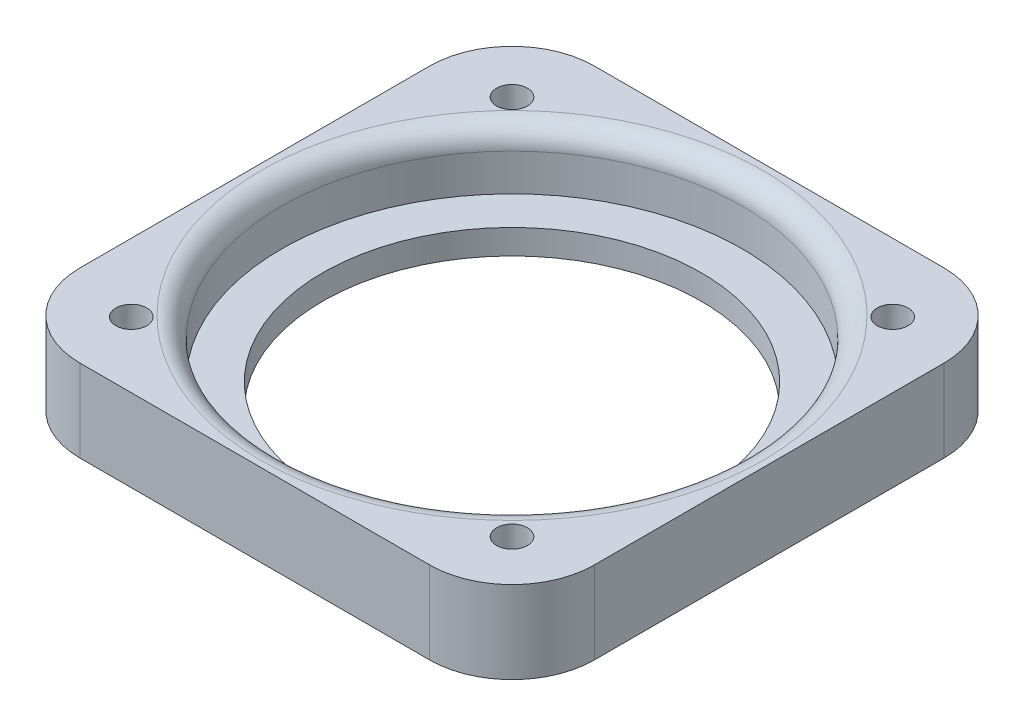
ISO-10303-21;
HEADER;
FILE_DESCRIPTION(('STEP AP214'),'2;1');
FILE_NAME('part.step','',(''),(''),'','','');
FILE_SCHEMA(('AUTOMOTIVE_DESIGN { 1 0 10303 214 1 1 1 1 }'));
ENDSEC;
DATA;
#1=APPLICATION_CONTEXT('core data for automotive mechanical design processes');
#2=APPLICATION_PROTOCOL_DEFINITION('international standard','automotive_design',2000,#1);
#3=PRODUCT_CONTEXT('',#1,'mechanical');
#4=PRODUCT('Part','Part','',(#3));
#5=PRODUCT_RELATED_PRODUCT_CATEGORY('part','',(#4));
#6=PRODUCT_DEFINITION_FORMATION('','',#4);
#7=PRODUCT_DEFINITION_CONTEXT('part definition',#1,'design');
#8=PRODUCT_DEFINITION('design','',#6,#7);
#9=PRODUCT_DEFINITION_SHAPE('','',#8);
#10=(LENGTH_UNIT() NAMED_UNIT(*) SI_UNIT(.MILLI.,.METRE.));
#11=(NAMED_UNIT(*) PLANE_ANGLE_UNIT() SI_UNIT($,.RADIAN.));
#12=(NAMED_UNIT(*) SI_UNIT($,.STERADIAN.) SOLID_ANGLE_UNIT());
#13=UNCERTAINTY_MEASURE_WITH_UNIT(LENGTH_MEASURE(1.E-05),#10,'distance_accuracy_value','');
#14=(GEOMETRIC_REPRESENTATION_CONTEXT(3) GLOBAL_UNCERTAINTY_ASSIGNED_CONTEXT((#13)) GLOBAL_UNIT_ASSIGNED_CONTEXT((#10,
#11,#12)) REPRESENTATION_CONTEXT('',''));
#15=CARTESIAN_POINT('',(0.,0.,0.));
#16=DIRECTION('',(0.,0.,1.));
#17=DIRECTION('',(1.,0.,0.));
#18=AXIS2_PLACEMENT_3D('',#15,#16,#17);
#19=CARTESIAN_POINT('',(-18.3847763108502,8.,-18.3847763108502));
#20=DIRECTION('',(0.,-1.,0.));
#21=DIRECTION('',(0.,0.,-1.));
#22=AXIS2_PLACEMENT_3D('',#19,#20,#21);
#23=CYLINDRICAL_SURFACE('',#22,1.5);
#24=CARTESIAN_POINT('',(-18.3847763108502,8.,-18.3847763108502));
#25=DIRECTION('',(0.,1.,0.));
#26=DIRECTION('',(0.,0.,1.));
#27=AXIS2_PLACEMENT_3D('',#24,#25,#26);
#28=CIRCLE('',#27,1.5);
#29=CARTESIAN_POINT('',(-18.3847763108502,8.,-16.8847763108502));
#30=VERTEX_POINT('',#29);
#31=EDGE_CURVE('E242',#30,#30,#28,.T.);
#32=ORIENTED_EDGE('',*,*,#31,.T.);
#33=EDGE_LOOP('',(#32));
#34=FACE_BOUND('',#33,.T.);
#35=CARTESIAN_POINT('',(-18.3847763108502,2.,-18.3847763108502));
#36=DIRECTION('',(0.,-1.,0.));
#37=DIRECTION('',(0.,0.,-1.));
#38=AXIS2_PLACEMENT_3D('',#35,#36,#37);
#39=CIRCLE('',#38,1.5);
#40=CARTESIAN_POINT('',(-18.3847763108502,2.,-19.8847763108502));
#41=VERTEX_POINT('',#40);
#42=EDGE_CURVE('E133',#41,#41,#39,.T.);
#43=ORIENTED_EDGE('',*,*,#42,.T.);
#44=EDGE_LOOP('',(#43));
#45=FACE_BOUND('',#44,.T.);
#46=ADVANCED_FACE('F129',(#34,#45),#23,.F.);
#47=CARTESIAN_POINT('',(18.6152236891498,8.,-18.3847763108513));
#48=DIRECTION('',(0.,-1.,0.));
#49=DIRECTION('',(0.,0.,-1.));
#50=AXIS2_PLACEMENT_3D('',#47,#48,#49);
#51=CYLINDRICAL_SURFACE('',#50,1.5);
#52=CARTESIAN_POINT('',(18.6152236891498,8.,-18.3847763108513));
#53=DIRECTION('',(0.,1.,0.));
#54=DIRECTION('',(0.,0.,1.));
#55=AXIS2_PLACEMENT_3D('',#52,#53,#54);
#56=CIRCLE('',#55,1.5);
#57=CARTESIAN_POINT('',(18.6152236891498,8.,-16.8847763108513));
#58=VERTEX_POINT('',#57);
#59=EDGE_CURVE('E226',#58,#58,#56,.T.);
#60=ORIENTED_EDGE('',*,*,#59,.T.);
#61=EDGE_LOOP('',(#60));
#62=FACE_BOUND('',#61,.T.);
#63=CARTESIAN_POINT('',(18.6152236891498,2.,-18.3847763108513));
#64=DIRECTION('',(0.,-1.,0.));
#65=DIRECTION('',(0.,0.,-1.));
#66=AXIS2_PLACEMENT_3D('',#63,#64,#65);
#67=CIRCLE('',#66,1.5);
#68=CARTESIAN_POINT('',(18.6152236891498,2.,-19.8847763108513));
#69=VERTEX_POINT('',#68);
#70=EDGE_CURVE('E297',#69,#69,#67,.T.);
#71=ORIENTED_EDGE('',*,*,#70,.T.);
#72=EDGE_LOOP('',(#71));
#73=FACE_BOUND('',#72,.T.);
#74=ADVANCED_FACE('F352',(#62,#73),#51,.F.);
#75=CARTESIAN_POINT('',(18.6152236891508,8.,18.6152236891487));
#76=DIRECTION('',(0.,-1.,0.));
#77=DIRECTION('',(0.,0.,-1.));
#78=AXIS2_PLACEMENT_3D('',#75,#76,#77);
#79=CYLINDRICAL_SURFACE('',#78,1.5);
#80=CARTESIAN_POINT('',(18.6152236891508,8.,18.6152236891487));
#81=DIRECTION('',(0.,1.,0.));
#82=DIRECTION('',(0.,0.,1.));
#83=AXIS2_PLACEMENT_3D('',#80,#81,#82);
#84=CIRCLE('',#83,1.5);
#85=CARTESIAN_POINT('',(18.6152236891508,8.,20.1152236891487));
#86=VERTEX_POINT('',#85);
#87=EDGE_CURVE('E229',#86,#86,#84,.T.);
#88=ORIENTED_EDGE('',*,*,#87,.T.);
#89=EDGE_LOOP('',(#88));
#90=FACE_BOUND('',#89,.T.);
#91=CARTESIAN_POINT('',(18.6152236891508,2.,18.6152236891487));
#92=DIRECTION('',(0.,-1.,0.));
#93=DIRECTION('',(0.,0.,-1.));
#94=AXIS2_PLACEMENT_3D('',#91,#92,#93);
#95=CIRCLE('',#94,1.5);
#96=CARTESIAN_POINT('',(18.6152236891508,2.,17.1152236891487));
#97=VERTEX_POINT('',#96);
#98=EDGE_CURVE('E293',#97,#97,#95,.T.);
#99=ORIENTED_EDGE('',*,*,#98,.T.);
#100=EDGE_LOOP('',(#99));
#101=FACE_BOUND('',#100,.T.);
#102=ADVANCED_FACE('F357',(#90,#101),#79,.F.);
#103=CARTESIAN_POINT('',(-18.3847763108492,8.,18.6152236891498));
#104=DIRECTION('',(0.,-1.,0.));
#105=DIRECTION('',(0.,0.,-1.));
#106=AXIS2_PLACEMENT_3D('',#103,#104,#105);
#107=CYLINDRICAL_SURFACE('',#106,1.5);
#108=CARTESIAN_POINT('',(-18.3847763108492,8.,18.6152236891498));
#109=DIRECTION('',(0.,1.,0.));
#110=DIRECTION('',(0.,0.,1.));
#111=AXIS2_PLACEMENT_3D('',#108,#109,#110);
#112=CIRCLE('',#111,1.5);
#113=CARTESIAN_POINT('',(-18.3847763108492,8.,20.1152236891498));
#114=VERTEX_POINT('',#113);
#115=EDGE_CURVE('E224',#114,#114,#112,.T.);
#116=ORIENTED_EDGE('',*,*,#115,.T.);
#117=EDGE_LOOP('',(#116));
#118=FACE_BOUND('',#117,.T.);
#119=CARTESIAN_POINT('',(-18.3847763108492,2.,18.6152236891498));
#120=DIRECTION('',(0.,-1.,0.));
#121=DIRECTION('',(0.,0.,-1.));
#122=AXIS2_PLACEMENT_3D('',#119,#120,#121);
#123=CIRCLE('',#122,1.5);
#124=CARTESIAN_POINT('',(-18.3847763108492,2.,17.1152236891498));
#125=VERTEX_POINT('',#124);
#126=EDGE_CURVE('E289',#125,#125,#123,.T.);
#127=ORIENTED_EDGE('',*,*,#126,.T.);
#128=EDGE_LOOP('',(#127));
#129=FACE_BOUND('',#128,.T.);
#130=ADVANCED_FACE('F371',(#118,#129),#107,.F.);
#131=CARTESIAN_POINT('',(0.,8.,0.));
#132=DIRECTION('',(0.,1.,0.));
#133=DIRECTION('',(0.,0.,1.));
#134=AXIS2_PLACEMENT_3D('',#131,#132,#133);
#135=PLANE('',#134);
#136=CARTESIAN_POINT('',(0.,8.,0.));
#137=DIRECTION('',(0.,1.,0.));
#138=DIRECTION('',(0.,0.,1.));
#139=AXIS2_PLACEMENT_3D('',#136,#137,#138);
#140=CIRCLE('',#139,24.4);
#141=CARTESIAN_POINT('',(0.,8.,24.4));
#142=VERTEX_POINT('',#141);
#143=EDGE_CURVE('E12',#142,#142,#140,.F.);
#144=ORIENTED_EDGE('',*,*,#143,.T.);
#145=EDGE_LOOP('',(#144));
#146=FACE_BOUND('',#145,.T.);
#147=ORIENTED_EDGE('',*,*,#59,.F.);
#148=EDGE_LOOP('',(#147));
#149=FACE_BOUND('',#148,.T.);
#150=ORIENTED_EDGE('',*,*,#87,.F.);
#151=EDGE_LOOP('',(#150));
#152=FACE_BOUND('',#151,.T.);
#153=ORIENTED_EDGE('',*,*,#115,.F.);
#154=EDGE_LOOP('',(#153));
#155=FACE_BOUND('',#154,.T.);
#156=ORIENTED_EDGE('',*,*,#31,.F.);
#157=EDGE_LOOP('',(#156));
#158=FACE_BOUND('',#157,.T.);
#159=DIRECTION('',(0.,0.,1.));
#160=VECTOR('',#159,1.);
#161=CARTESIAN_POINT('',(-25.,8.,0.));
#162=LINE('',#161,#160);
#163=CARTESIAN_POINT('',(-25.,8.,-17.));
#164=VERTEX_POINT('',#163);
#165=CARTESIAN_POINT('',(-25.,8.,17.));
#166=VERTEX_POINT('',#165);
#167=EDGE_CURVE('E248',#164,#166,#162,.T.);
#168=ORIENTED_EDGE('',*,*,#167,.T.);
#169=CARTESIAN_POINT('',(-17.,8.,17.));
#170=DIRECTION('',(0.,1.,0.));
#171=DIRECTION('',(0.,0.,1.));
#172=AXIS2_PLACEMENT_3D('',#169,#170,#171);
#173=CIRCLE('',#172,8.);
#174=CARTESIAN_POINT('',(-17.,8.,25.));
#175=VERTEX_POINT('',#174);
#176=EDGE_CURVE('E276',#166,#175,#173,.T.);
#177=ORIENTED_EDGE('',*,*,#176,.T.);
#178=DIRECTION('',(1.,0.,0.));
#179=VECTOR('',#178,1.);
#180=CARTESIAN_POINT('',(0.,8.,25.));
#181=LINE('',#180,#179);
#182=CARTESIAN_POINT('',(17.,8.,25.));
#183=VERTEX_POINT('',#182);
#184=EDGE_CURVE('E218',#175,#183,#181,.T.);
#185=ORIENTED_EDGE('',*,*,#184,.T.);
#186=CARTESIAN_POINT('',(17.,8.,17.));
#187=DIRECTION('',(0.,1.,0.));
#188=DIRECTION('',(0.,0.,1.));
#189=AXIS2_PLACEMENT_3D('',#186,#187,#188);
#190=CIRCLE('',#189,8.);
#191=CARTESIAN_POINT('',(25.,8.,17.));
#192=VERTEX_POINT('',#191);
#193=EDGE_CURVE('E274',#183,#192,#190,.T.);
#194=ORIENTED_EDGE('',*,*,#193,.T.);
#195=DIRECTION('',(0.,0.,1.));
#196=VECTOR('',#195,1.);
#197=CARTESIAN_POINT('',(25.,8.,0.));
#198=LINE('',#197,#196);
#199=CARTESIAN_POINT('',(25.,8.,-17.));
#200=VERTEX_POINT('',#199);
#201=EDGE_CURVE('E237',#200,#192,#198,.T.);
#202=ORIENTED_EDGE('',*,*,#201,.F.);
#203=CARTESIAN_POINT('',(17.,8.,-17.));
#204=DIRECTION('',(0.,1.,0.));
#205=DIRECTION('',(0.,0.,1.));
#206=AXIS2_PLACEMENT_3D('',#203,#204,#205);
#207=CIRCLE('',#206,8.);
#208=CARTESIAN_POINT('',(17.,8.,-25.));
#209=VERTEX_POINT('',#208);
#210=EDGE_CURVE('E146',#200,#209,#207,.T.);
#211=ORIENTED_EDGE('',*,*,#210,.T.);
#212=DIRECTION('',(1.,0.,0.));
#213=VECTOR('',#212,1.);
#214=CARTESIAN_POINT('',(0.,8.,-25.));
#215=LINE('',#214,#213);
#216=CARTESIAN_POINT('',(-17.,8.,-25.));
#217=VERTEX_POINT('',#216);
#218=EDGE_CURVE('E245',#217,#209,#215,.T.);
#219=ORIENTED_EDGE('',*,*,#218,.F.);
#220=CARTESIAN_POINT('',(-17.,8.,-17.));
#221=DIRECTION('',(0.,1.,0.));
#222=DIRECTION('',(0.,0.,1.));
#223=AXIS2_PLACEMENT_3D('',#220,#221,#222);
#224=CIRCLE('',#223,8.);
#225=EDGE_CURVE('E271',#217,#164,#224,.T.);
#226=ORIENTED_EDGE('',*,*,#225,.T.);
#227=EDGE_LOOP('',(#168,#177,#185,#194,#202,#211,#219,#226));
#228=FACE_BOUND('',#227,.T.);
#229=ADVANCED_FACE('F331',(#146,#149,#152,#155,#158,#228),#135,.T.);
#230=CARTESIAN_POINT('',(0.,0.,0.));
#231=DIRECTION('',(0.,1.,0.));
#232=DIRECTION('',(0.,0.,1.));
#233=AXIS2_PLACEMENT_3D('',#230,#231,#232);
#234=PLANE('',#233);
#235=CARTESIAN_POINT('',(18.3847763108492,0.,-18.6152236891498));
#236=DIRECTION('',(0.,-1.,0.));
#237=DIRECTION('',(0.,0.,1.));
#238=AXIS2_PLACEMENT_3D('',#235,#236,#237);
#239=CIRCLE('',#238,3.5);
#240=CARTESIAN_POINT('',(18.3847763108492,0.,-15.1152236891498));
#241=VERTEX_POINT('',#240);
#242=EDGE_CURVE('E305',#241,#241,#239,.T.);
#243=ORIENTED_EDGE('',*,*,#242,.F.);
#244=EDGE_LOOP('',(#243));
#245=FACE_BOUND('',#244,.T.);
#246=CARTESIAN_POINT('',(-18.61522368915,0.,-18.384776310849));
#247=DIRECTION('',(0.,-1.,0.));
#248=DIRECTION('',(1.,0.,0.));
#249=AXIS2_PLACEMENT_3D('',#246,#247,#248);
#250=CIRCLE('',#249,3.5);
#251=CARTESIAN_POINT('',(-15.11522368915,0.,-18.384776310849));
#252=VERTEX_POINT('',#251);
#253=EDGE_CURVE('E315',#252,#252,#250,.T.);
#254=ORIENTED_EDGE('',*,*,#253,.F.);
#255=EDGE_LOOP('',(#254));
#256=FACE_BOUND('',#255,.T.);
#257=CARTESIAN_POINT('',(18.6152236891498,0.,18.3847763108491));
#258=DIRECTION('',(0.,-1.,0.));
#259=DIRECTION('',(-1.,0.,0.));
#260=AXIS2_PLACEMENT_3D('',#257,#258,#259);
#261=CIRCLE('',#260,3.5);
#262=CARTESIAN_POINT('',(15.1152236891498,0.,18.3847763108491));
#263=VERTEX_POINT('',#262);
#264=EDGE_CURVE('E303',#263,#263,#261,.T.);
#265=ORIENTED_EDGE('',*,*,#264,.F.);
#266=EDGE_LOOP('',(#265));
#267=FACE_BOUND('',#266,.T.);
#268=CARTESIAN_POINT('',(-18.3847763108492,0.,18.6152236891498));
#269=DIRECTION('',(0.,-1.,0.));
#270=DIRECTION('',(0.,0.,-1.));
#271=AXIS2_PLACEMENT_3D('',#268,#269,#270);
#272=CIRCLE('',#271,3.5);
#273=CARTESIAN_POINT('',(-18.3847763108492,0.,15.1152236891498));
#274=VERTEX_POINT('',#273);
#275=EDGE_CURVE('E295',#274,#274,#272,.T.);
#276=ORIENTED_EDGE('',*,*,#275,.F.);
#277=EDGE_LOOP('',(#276));
#278=FACE_BOUND('',#277,.T.);
#279=CARTESIAN_POINT('',(0.,0.,0.));
#280=DIRECTION('',(0.,1.,0.));
#281=DIRECTION('',(0.,0.,1.));
#282=AXIS2_PLACEMENT_3D('',#279,#280,#281);
#283=CIRCLE('',#282,18.4);
#284=CARTESIAN_POINT('',(0.,0.,18.4));
#285=VERTEX_POINT('',#284);
#286=EDGE_CURVE('E257',#285,#285,#283,.T.);
#287=ORIENTED_EDGE('',*,*,#286,.T.);
#288=EDGE_LOOP('',(#287));
#289=FACE_BOUND('',#288,.T.);
#290=DIRECTION('',(1.,0.,0.));
#291=VECTOR('',#290,1.);
#292=CARTESIAN_POINT('',(0.,0.,25.));
#293=LINE('',#292,#291);
#294=CARTESIAN_POINT('',(-17.,0.,25.));
#295=VERTEX_POINT('',#294);
#296=CARTESIAN_POINT('',(17.,0.,25.));
#297=VERTEX_POINT('',#296);
#298=EDGE_CURVE('E215',#295,#297,#293,.T.);
#299=ORIENTED_EDGE('',*,*,#298,.F.);
#300=CARTESIAN_POINT('',(-17.,0.,17.));
#301=DIRECTION('',(0.,1.,0.));
#302=DIRECTION('',(0.,0.,1.));
#303=AXIS2_PLACEMENT_3D('',#300,#301,#302);
#304=CIRCLE('',#303,8.);
#305=CARTESIAN_POINT('',(-25.,0.,17.));
#306=VERTEX_POINT('',#305);
#307=EDGE_CURVE('E198',#295,#306,#304,.F.);
#308=ORIENTED_EDGE('',*,*,#307,.T.);
#309=DIRECTION('',(0.,0.,1.));
#310=VECTOR('',#309,1.);
#311=CARTESIAN_POINT('',(-25.,0.,0.));
#312=LINE('',#311,#310);
#313=CARTESIAN_POINT('',(-25.,0.,-17.));
#314=VERTEX_POINT('',#313);
#315=EDGE_CURVE('E246',#314,#306,#312,.T.);
#316=ORIENTED_EDGE('',*,*,#315,.F.);
#317=CARTESIAN_POINT('',(-17.,0.,-17.));
#318=DIRECTION('',(0.,1.,0.));
#319=DIRECTION('',(0.,0.,1.));
#320=AXIS2_PLACEMENT_3D('',#317,#318,#319);
#321=CIRCLE('',#320,8.);
#322=CARTESIAN_POINT('',(-17.,0.,-25.));
#323=VERTEX_POINT('',#322);
#324=EDGE_CURVE('E219',#314,#323,#321,.F.);
#325=ORIENTED_EDGE('',*,*,#324,.T.);
#326=DIRECTION('',(1.,0.,0.));
#327=VECTOR('',#326,1.);
#328=CARTESIAN_POINT('',(0.,0.,-25.));
#329=LINE('',#328,#327);
#330=CARTESIAN_POINT('',(17.,0.,-25.));
#331=VERTEX_POINT('',#330);
#332=EDGE_CURVE('E236',#323,#331,#329,.T.);
#333=ORIENTED_EDGE('',*,*,#332,.T.);
#334=CARTESIAN_POINT('',(17.,0.,-17.));
#335=DIRECTION('',(0.,1.,0.));
#336=DIRECTION('',(0.,0.,1.));
#337=AXIS2_PLACEMENT_3D('',#334,#335,#336);
#338=CIRCLE('',#337,8.);
#339=CARTESIAN_POINT('',(25.,0.,-17.));
#340=VERTEX_POINT('',#339);
#341=EDGE_CURVE('E265',#331,#340,#338,.F.);
#342=ORIENTED_EDGE('',*,*,#341,.T.);
#343=DIRECTION('',(0.,0.,1.));
#344=VECTOR('',#343,1.);
#345=CARTESIAN_POINT('',(25.,0.,0.));
#346=LINE('',#345,#344);
#347=CARTESIAN_POINT('',(25.,0.,17.));
#348=VERTEX_POINT('',#347);
#349=EDGE_CURVE('E234',#340,#348,#346,.T.);
#350=ORIENTED_EDGE('',*,*,#349,.T.);
#351=CARTESIAN_POINT('',(17.,0.,17.));
#352=DIRECTION('',(0.,1.,0.));
#353=DIRECTION('',(0.,0.,1.));
#354=AXIS2_PLACEMENT_3D('',#351,#352,#353);
#355=CIRCLE('',#354,8.);
#356=EDGE_CURVE('E209',#348,#297,#355,.F.);
#357=ORIENTED_EDGE('',*,*,#356,.T.);
#358=EDGE_LOOP('',(#299,#308,#316,#325,#333,#342,#350,#357));
#359=FACE_BOUND('',#358,.T.);
#360=ADVANCED_FACE('F222',(#245,#256,#267,#278,#289,#359),#234,.F.);
#361=CARTESIAN_POINT('',(0.,2.4,0.));
#362=DIRECTION('',(0.,1.,0.));
#363=DIRECTION('',(0.,0.,1.));
#364=AXIS2_PLACEMENT_3D('',#361,#362,#363);
#365=CYLINDRICAL_SURFACE('',#364,22.4);
#366=CARTESIAN_POINT('',(0.,6.,0.));
#367=DIRECTION('',(0.,1.,0.));
#368=DIRECTION('',(0.,0.,1.));
#369=AXIS2_PLACEMENT_3D('',#366,#367,#368);
#370=CIRCLE('',#369,22.4);
#371=CARTESIAN_POINT('',(0.,6.,22.4));
#372=VERTEX_POINT('',#371);
#373=EDGE_CURVE('E138',#372,#372,#370,.T.);
#374=ORIENTED_EDGE('',*,*,#373,.T.);
#375=EDGE_LOOP('',(#374));
#376=FACE_BOUND('',#375,.T.);
#377=CARTESIAN_POINT('',(0.,2.4,0.));
#378=DIRECTION('',(0.,1.,0.));
#379=DIRECTION('',(0.,0.,1.));
#380=AXIS2_PLACEMENT_3D('',#377,#378,#379);
#381=CIRCLE('',#380,22.4);
#382=CARTESIAN_POINT('',(0.,2.4,22.4));
#383=VERTEX_POINT('',#382);
#384=EDGE_CURVE('E260',#383,#383,#381,.T.);
#385=ORIENTED_EDGE('',*,*,#384,.F.);
#386=EDGE_LOOP('',(#385));
#387=FACE_BOUND('',#386,.T.);
#388=ADVANCED_FACE('F330',(#376,#387),#365,.F.);
#389=CARTESIAN_POINT('',(0.,2.4,0.));
#390=DIRECTION('',(0.,1.,0.));
#391=DIRECTION('',(0.,0.,1.));
#392=AXIS2_PLACEMENT_3D('',#389,#390,#391);
#393=PLANE('',#392);
#394=CARTESIAN_POINT('',(0.,2.4,0.));
#395=DIRECTION('',(0.,1.,0.));
#396=DIRECTION('',(0.,0.,1.));
#397=AXIS2_PLACEMENT_3D('',#394,#395,#396);
#398=CIRCLE('',#397,18.4);
#399=CARTESIAN_POINT('',(0.,2.4,18.4));
#400=VERTEX_POINT('',#399);
#401=EDGE_CURVE('E251',#400,#400,#398,.T.);
#402=ORIENTED_EDGE('',*,*,#401,.F.);
#403=EDGE_LOOP('',(#402));
#404=FACE_BOUND('',#403,.T.);
#405=ORIENTED_EDGE('',*,*,#384,.T.);
#406=EDGE_LOOP('',(#405));
#407=FACE_BOUND('',#406,.T.);
#408=ADVANCED_FACE('F339',(#404,#407),#393,.T.);
#409=CARTESIAN_POINT('',(0.,-10.1,0.));
#410=DIRECTION('',(0.,1.,0.));
#411=DIRECTION('',(0.,0.,1.));
#412=AXIS2_PLACEMENT_3D('',#409,#410,#411);
#413=CYLINDRICAL_SURFACE('',#412,18.4);
#414=ORIENTED_EDGE('',*,*,#401,.T.);
#415=EDGE_LOOP('',(#414));
#416=FACE_BOUND('',#415,.T.);
#417=ORIENTED_EDGE('',*,*,#286,.F.);
#418=EDGE_LOOP('',(#417));
#419=FACE_BOUND('',#418,.T.);
#420=ADVANCED_FACE('F336',(#416,#419),#413,.F.);
#421=CARTESIAN_POINT('',(0.,8.,-25.));
#422=DIRECTION('',(0.,0.,-1.));
#423=DIRECTION('',(-1.,0.,0.));
#424=AXIS2_PLACEMENT_3D('',#421,#422,#423);
#425=PLANE('',#424);
#426=ORIENTED_EDGE('',*,*,#218,.T.);
#427=DIRECTION('',(0.,-1.,0.));
#428=VECTOR('',#427,1.);
#429=CARTESIAN_POINT('',(17.,8.,-25.));
#430=LINE('',#429,#428);
#431=EDGE_CURVE('E284',#209,#331,#430,.T.);
#432=ORIENTED_EDGE('',*,*,#431,.T.);
#433=ORIENTED_EDGE('',*,*,#332,.F.);
#434=DIRECTION('',(0.,-1.,0.));
#435=VECTOR('',#434,1.);
#436=CARTESIAN_POINT('',(-17.,8.,-25.));
#437=LINE('',#436,#435);
#438=EDGE_CURVE('E153',#323,#217,#437,.F.);
#439=ORIENTED_EDGE('',*,*,#438,.T.);
#440=EDGE_LOOP('',(#426,#432,#433,#439));
#441=FACE_BOUND('',#440,.T.);
#442=ADVANCED_FACE('F338',(#441),#425,.T.);
#443=CARTESIAN_POINT('',(-25.,8.,0.));
#444=DIRECTION('',(1.,0.,0.));
#445=DIRECTION('',(0.,0.,-1.));
#446=AXIS2_PLACEMENT_3D('',#443,#444,#445);
#447=PLANE('',#446);
#448=ORIENTED_EDGE('',*,*,#315,.T.);
#449=DIRECTION('',(0.,-1.,0.));
#450=VECTOR('',#449,1.);
#451=CARTESIAN_POINT('',(-25.,8.,17.));
#452=LINE('',#451,#450);
#453=EDGE_CURVE('E203',#306,#166,#452,.F.);
#454=ORIENTED_EDGE('',*,*,#453,.T.);
#455=ORIENTED_EDGE('',*,*,#167,.F.);
#456=DIRECTION('',(0.,-1.,0.));
#457=VECTOR('',#456,1.);
#458=CARTESIAN_POINT('',(-25.,0.,-17.));
#459=LINE('',#458,#457);
#460=EDGE_CURVE('E208',#164,#314,#459,.T.);
#461=ORIENTED_EDGE('',*,*,#460,.T.);
#462=EDGE_LOOP('',(#448,#454,#455,#461));
#463=FACE_BOUND('',#462,.T.);
#464=ADVANCED_FACE('F346',(#463),#447,.F.);
#465=CARTESIAN_POINT('',(25.,8.,0.));
#466=DIRECTION('',(1.,0.,0.));
#467=DIRECTION('',(0.,0.,-1.));
#468=AXIS2_PLACEMENT_3D('',#465,#466,#467);
#469=PLANE('',#468);
#470=ORIENTED_EDGE('',*,*,#201,.T.);
#471=DIRECTION('',(0.,-1.,0.));
#472=VECTOR('',#471,1.);
#473=CARTESIAN_POINT('',(25.,0.,17.));
#474=LINE('',#473,#472);
#475=EDGE_CURVE('E280',#192,#348,#474,.T.);
#476=ORIENTED_EDGE('',*,*,#475,.T.);
#477=ORIENTED_EDGE('',*,*,#349,.F.);
#478=DIRECTION('',(0.,-1.,0.));
#479=VECTOR('',#478,1.);
#480=CARTESIAN_POINT('',(25.,8.,-17.));
#481=LINE('',#480,#479);
#482=EDGE_CURVE('E278',#340,#200,#481,.F.);
#483=ORIENTED_EDGE('',*,*,#482,.T.);
#484=EDGE_LOOP('',(#470,#476,#477,#483));
#485=FACE_BOUND('',#484,.T.);
#486=ADVANCED_FACE('F364',(#485),#469,.T.);
#487=CARTESIAN_POINT('',(0.,8.,25.));
#488=DIRECTION('',(0.,0.,-1.));
#489=DIRECTION('',(-1.,0.,0.));
#490=AXIS2_PLACEMENT_3D('',#487,#488,#489);
#491=PLANE('',#490);
#492=ORIENTED_EDGE('',*,*,#184,.F.);
#493=DIRECTION('',(0.,-1.,0.));
#494=VECTOR('',#493,1.);
#495=CARTESIAN_POINT('',(-17.,8.,25.));
#496=LINE('',#495,#494);
#497=EDGE_CURVE('E202',#175,#295,#496,.T.);
#498=ORIENTED_EDGE('',*,*,#497,.T.);
#499=ORIENTED_EDGE('',*,*,#298,.T.);
#500=DIRECTION('',(0.,-1.,0.));
#501=VECTOR('',#500,1.);
#502=CARTESIAN_POINT('',(17.,8.,25.));
#503=LINE('',#502,#501);
#504=EDGE_CURVE('E220',#297,#183,#503,.F.);
#505=ORIENTED_EDGE('',*,*,#504,.T.);
#506=EDGE_LOOP('',(#492,#498,#499,#505));
#507=FACE_BOUND('',#506,.T.);
#508=ADVANCED_FACE('F214',(#507),#491,.F.);
#509=CARTESIAN_POINT('',(-17.,8.,17.));
#510=DIRECTION('',(0.,-1.,0.));
#511=DIRECTION('',(0.,0.,-1.));
#512=AXIS2_PLACEMENT_3D('',#509,#510,#511);
#513=CYLINDRICAL_SURFACE('',#512,8.);
#514=ORIENTED_EDGE('',*,*,#176,.F.);
#515=ORIENTED_EDGE('',*,*,#453,.F.);
#516=ORIENTED_EDGE('',*,*,#307,.F.);
#517=ORIENTED_EDGE('',*,*,#497,.F.);
#518=EDGE_LOOP('',(#514,#515,#516,#517));
#519=FACE_BOUND('',#518,.T.);
#520=ADVANCED_FACE('F201',(#519),#513,.T.);
#521=CARTESIAN_POINT('',(17.,8.,17.));
#522=DIRECTION('',(0.,1.,0.));
#523=DIRECTION('',(0.,0.,1.));
#524=AXIS2_PLACEMENT_3D('',#521,#522,#523);
#525=CYLINDRICAL_SURFACE('',#524,8.);
#526=ORIENTED_EDGE('',*,*,#193,.F.);
#527=ORIENTED_EDGE('',*,*,#504,.F.);
#528=ORIENTED_EDGE('',*,*,#356,.F.);
#529=ORIENTED_EDGE('',*,*,#475,.F.);
#530=EDGE_LOOP('',(#526,#527,#528,#529));
#531=FACE_BOUND('',#530,.T.);
#532=ADVANCED_FACE('F529',(#531),#525,.T.);
#533=CARTESIAN_POINT('',(17.,8.,-17.));
#534=DIRECTION('',(0.,-1.,0.));
#535=DIRECTION('',(0.,0.,-1.));
#536=AXIS2_PLACEMENT_3D('',#533,#534,#535);
#537=CYLINDRICAL_SURFACE('',#536,8.);
#538=ORIENTED_EDGE('',*,*,#210,.F.);
#539=ORIENTED_EDGE('',*,*,#482,.F.);
#540=ORIENTED_EDGE('',*,*,#341,.F.);
#541=ORIENTED_EDGE('',*,*,#431,.F.);
#542=EDGE_LOOP('',(#538,#539,#540,#541));
#543=FACE_BOUND('',#542,.T.);
#544=ADVANCED_FACE('F538',(#543),#537,.T.);
#545=CARTESIAN_POINT('',(-17.,8.,-17.));
#546=DIRECTION('',(0.,1.,0.));
#547=DIRECTION('',(0.,0.,1.));
#548=AXIS2_PLACEMENT_3D('',#545,#546,#547);
#549=CYLINDRICAL_SURFACE('',#548,8.);
#550=ORIENTED_EDGE('',*,*,#225,.F.);
#551=ORIENTED_EDGE('',*,*,#438,.F.);
#552=ORIENTED_EDGE('',*,*,#324,.F.);
#553=ORIENTED_EDGE('',*,*,#460,.F.);
#554=EDGE_LOOP('',(#550,#551,#552,#553));
#555=FACE_BOUND('',#554,.T.);
#556=ADVANCED_FACE('F548',(#555),#549,.T.);
#557=CARTESIAN_POINT('',(0.,6.,0.));
#558=DIRECTION('',(0.,1.,0.));
#559=DIRECTION('',(0.,0.,1.));
#560=AXIS2_PLACEMENT_3D('',#557,#558,#559);
#561=TOROIDAL_SURFACE('',#560,24.4,2.);
#562=ORIENTED_EDGE('',*,*,#143,.F.);
#563=EDGE_LOOP('',(#562));
#564=FACE_BOUND('',#563,.T.);
#565=ORIENTED_EDGE('',*,*,#373,.F.);
#566=EDGE_LOOP('',(#565));
#567=FACE_BOUND('',#566,.T.);
#568=ADVANCED_FACE('F131',(#564,#567),#561,.T.);
#569=CARTESIAN_POINT('',(-18.3847763108492,2.,18.6152236891498));
#570=DIRECTION('',(0.,-1.,0.));
#571=DIRECTION('',(0.,0.,-1.));
#572=AXIS2_PLACEMENT_3D('',#569,#570,#571);
#573=CYLINDRICAL_SURFACE('',#572,3.5);
#574=CARTESIAN_POINT('',(-18.3847763108492,2.,18.6152236891498));
#575=DIRECTION('',(0.,-1.,0.));
#576=DIRECTION('',(0.,0.,-1.));
#577=AXIS2_PLACEMENT_3D('',#574,#575,#576);
#578=CIRCLE('',#577,3.5);
#579=CARTESIAN_POINT('',(-18.3847763108492,2.,15.1152236891498));
#580=VERTEX_POINT('',#579);
#581=EDGE_CURVE('E292',#580,#580,#578,.T.);
#582=ORIENTED_EDGE('',*,*,#581,.F.);
#583=EDGE_LOOP('',(#582));
#584=FACE_BOUND('',#583,.T.);
#585=ORIENTED_EDGE('',*,*,#275,.T.);
#586=EDGE_LOOP('',(#585));
#587=FACE_BOUND('',#586,.T.);
#588=ADVANCED_FACE('F326',(#584,#587),#573,.F.);
#589=CARTESIAN_POINT('',(-18.3847763108492,2.,18.6152236891498));
#590=DIRECTION('',(0.,-1.,0.));
#591=DIRECTION('',(0.,0.,-1.));
#592=AXIS2_PLACEMENT_3D('',#589,#590,#591);
#593=PLANE('',#592);
#594=ORIENTED_EDGE('',*,*,#126,.F.);
#595=EDGE_LOOP('',(#594));
#596=FACE_BOUND('',#595,.T.);
#597=ORIENTED_EDGE('',*,*,#581,.T.);
#598=EDGE_LOOP('',(#597));
#599=FACE_BOUND('',#598,.T.);
#600=ADVANCED_FACE('F380',(#596,#599),#593,.T.);
#601=CARTESIAN_POINT('',(18.6152236891498,2.,18.3847763108491));
#602=DIRECTION('',(0.,-1.,0.));
#603=DIRECTION('',(0.,0.,-1.));
#604=AXIS2_PLACEMENT_3D('',#601,#602,#603);
#605=CYLINDRICAL_SURFACE('',#604,3.5);
#606=CARTESIAN_POINT('',(18.6152236891498,2.,18.3847763108491));
#607=DIRECTION('',(0.,-1.,0.));
#608=DIRECTION('',(-1.,0.,0.));
#609=AXIS2_PLACEMENT_3D('',#606,#607,#608);
#610=CIRCLE('',#609,3.5);
#611=CARTESIAN_POINT('',(15.1152236891498,2.,18.3847763108491));
#612=VERTEX_POINT('',#611);
#613=EDGE_CURVE('E296',#612,#612,#610,.T.);
#614=ORIENTED_EDGE('',*,*,#613,.F.);
#615=EDGE_LOOP('',(#614));
#616=FACE_BOUND('',#615,.T.);
#617=ORIENTED_EDGE('',*,*,#264,.T.);
#618=EDGE_LOOP('',(#617));
#619=FACE_BOUND('',#618,.T.);
#620=ADVANCED_FACE('F384',(#616,#619),#605,.F.);
#621=CARTESIAN_POINT('',(18.6152236891498,2.,18.3847763108491));
#622=DIRECTION('',(0.,-1.,0.));
#623=DIRECTION('',(-1.,0.,0.));
#624=AXIS2_PLACEMENT_3D('',#621,#622,#623);
#625=PLANE('',#624);
#626=ORIENTED_EDGE('',*,*,#98,.F.);
#627=EDGE_LOOP('',(#626));
#628=FACE_BOUND('',#627,.T.);
#629=ORIENTED_EDGE('',*,*,#613,.T.);
#630=EDGE_LOOP('',(#629));
#631=FACE_BOUND('',#630,.T.);
#632=ADVANCED_FACE('F388',(#628,#631),#625,.T.);
#633=CARTESIAN_POINT('',(18.3847763108492,2.,-18.6152236891498));
#634=DIRECTION('',(0.,-1.,0.));
#635=DIRECTION('',(0.,0.,-1.));
#636=AXIS2_PLACEMENT_3D('',#633,#634,#635);
#637=CYLINDRICAL_SURFACE('',#636,3.5);
#638=CARTESIAN_POINT('',(18.3847763108492,2.,-18.6152236891498));
#639=DIRECTION('',(0.,-1.,0.));
#640=DIRECTION('',(0.,0.,1.));
#641=AXIS2_PLACEMENT_3D('',#638,#639,#640);
#642=CIRCLE('',#641,3.5);
#643=CARTESIAN_POINT('',(18.3847763108492,2.,-15.1152236891498));
#644=VERTEX_POINT('',#643);
#645=EDGE_CURVE('E299',#644,#644,#642,.T.);
#646=ORIENTED_EDGE('',*,*,#645,.F.);
#647=EDGE_LOOP('',(#646));
#648=FACE_BOUND('',#647,.T.);
#649=ORIENTED_EDGE('',*,*,#242,.T.);
#650=EDGE_LOOP('',(#649));
#651=FACE_BOUND('',#650,.T.);
#652=ADVANCED_FACE('F392',(#648,#651),#637,.F.);
#653=CARTESIAN_POINT('',(18.3847763108492,2.,-18.6152236891498));
#654=DIRECTION('',(0.,-1.,0.));
#655=DIRECTION('',(0.,0.,1.));
#656=AXIS2_PLACEMENT_3D('',#653,#654,#655);
#657=PLANE('',#656);
#658=ORIENTED_EDGE('',*,*,#70,.F.);
#659=EDGE_LOOP('',(#658));
#660=FACE_BOUND('',#659,.T.);
#661=ORIENTED_EDGE('',*,*,#645,.T.);
#662=EDGE_LOOP('',(#661));
#663=FACE_BOUND('',#662,.T.);
#664=ADVANCED_FACE('F398',(#660,#663),#657,.T.);
#665=CARTESIAN_POINT('',(-18.61522368915,2.,-18.384776310849));
#666=DIRECTION('',(0.,-1.,0.));
#667=DIRECTION('',(0.,0.,-1.));
#668=AXIS2_PLACEMENT_3D('',#665,#666,#667);
#669=CYLINDRICAL_SURFACE('',#668,3.5);
#670=CARTESIAN_POINT('',(-18.61522368915,2.,-18.384776310849));
#671=DIRECTION('',(0.,-1.,0.));
#672=DIRECTION('',(1.,0.,0.));
#673=AXIS2_PLACEMENT_3D('',#670,#671,#672);
#674=CIRCLE('',#673,3.5);
#675=CARTESIAN_POINT('',(-15.11522368915,2.,-18.384776310849));
#676=VERTEX_POINT('',#675);
#677=EDGE_CURVE('E310',#676,#676,#674,.T.);
#678=ORIENTED_EDGE('',*,*,#677,.F.);
#679=EDGE_LOOP('',(#678));
#680=FACE_BOUND('',#679,.T.);
#681=ORIENTED_EDGE('',*,*,#253,.T.);
#682=EDGE_LOOP('',(#681));
#683=FACE_BOUND('',#682,.T.);
#684=ADVANCED_FACE('F394',(#680,#683),#669,.F.);
#685=CARTESIAN_POINT('',(-18.61522368915,2.,-18.384776310849));
#686=DIRECTION('',(0.,-1.,0.));
#687=DIRECTION('',(1.,0.,0.));
#688=AXIS2_PLACEMENT_3D('',#685,#686,#687);
#689=PLANE('',#688);
#690=ORIENTED_EDGE('',*,*,#42,.F.);
#691=EDGE_LOOP('',(#690));
#692=FACE_BOUND('',#691,.T.);
#693=ORIENTED_EDGE('',*,*,#677,.T.);
#694=EDGE_LOOP('',(#693));
#695=FACE_BOUND('',#694,.T.);
#696=ADVANCED_FACE('F397',(#692,#695),#689,.T.);
#697=CLOSED_SHELL('',(#46,#74,#102,#130,#229,#360,#388,#408,#420,#442,#464,#486,#508,#520,#532,
#544,#556,#568,#588,#600,#620,#632,#652,#664,#684,#696));
#698=MANIFOLD_SOLID_BREP('B2',#697);
#699=ADVANCED_BREP_SHAPE_REPRESENTATION('',(#18,#698),#14);
#700=SHAPE_DEFINITION_REPRESENTATION(#9,#699);
ENDSEC;
END-ISO-10303-21;
